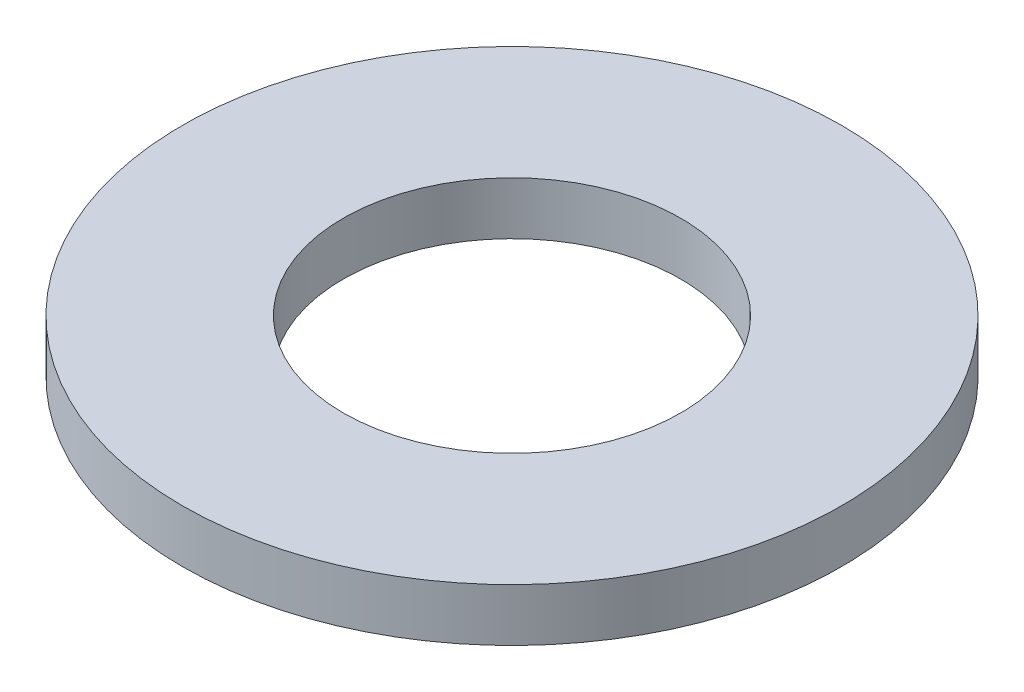
ISO-10303-21;
HEADER;
FILE_DESCRIPTION(('STEP AP214'),'2;1');
FILE_NAME('part.step','',(''),(''),'','','');
FILE_SCHEMA(('AUTOMOTIVE_DESIGN { 1 0 10303 214 1 1 1 1 }'));
ENDSEC;
DATA;
#1=APPLICATION_CONTEXT('core data for automotive mechanical design processes');
#2=APPLICATION_PROTOCOL_DEFINITION('international standard','automotive_design',2000,#1);
#3=PRODUCT_CONTEXT('',#1,'mechanical');
#4=PRODUCT('Part','Part','',(#3));
#5=PRODUCT_RELATED_PRODUCT_CATEGORY('part','',(#4));
#6=PRODUCT_DEFINITION_FORMATION('','',#4);
#7=PRODUCT_DEFINITION_CONTEXT('part definition',#1,'design');
#8=PRODUCT_DEFINITION('design','',#6,#7);
#9=PRODUCT_DEFINITION_SHAPE('','',#8);
#10=(LENGTH_UNIT() NAMED_UNIT(*) SI_UNIT(.MILLI.,.METRE.));
#11=(NAMED_UNIT(*) PLANE_ANGLE_UNIT() SI_UNIT($,.RADIAN.));
#12=(NAMED_UNIT(*) SI_UNIT($,.STERADIAN.) SOLID_ANGLE_UNIT());
#13=UNCERTAINTY_MEASURE_WITH_UNIT(LENGTH_MEASURE(1.E-05),#10,'distance_accuracy_value','');
#14=(GEOMETRIC_REPRESENTATION_CONTEXT(3) GLOBAL_UNCERTAINTY_ASSIGNED_CONTEXT((#13)) GLOBAL_UNIT_ASSIGNED_CONTEXT((#10,
#11,#12)) REPRESENTATION_CONTEXT('',''));
#15=CARTESIAN_POINT('',(0.,0.,0.));
#16=DIRECTION('',(0.,0.,1.));
#17=DIRECTION('',(1.,0.,0.));
#18=AXIS2_PLACEMENT_3D('',#15,#16,#17);
#19=CARTESIAN_POINT('',(0.,1.,0.));
#20=DIRECTION('',(0.,1.,0.));
#21=DIRECTION('',(0.,0.,1.));
#22=AXIS2_PLACEMENT_3D('',#19,#20,#21);
#23=PLANE('',#22);
#24=CARTESIAN_POINT('',(0.,1.,0.));
#25=DIRECTION('',(0.,1.,0.));
#26=DIRECTION('',(0.,0.,1.));
#27=AXIS2_PLACEMENT_3D('',#24,#25,#26);
#28=CIRCLE('',#27,6.25);
#29=CARTESIAN_POINT('',(0.,1.,6.25));
#30=VERTEX_POINT('',#29);
#31=EDGE_CURVE('E10',#30,#30,#28,.T.);
#32=ORIENTED_EDGE('',*,*,#31,.T.);
#33=EDGE_LOOP('',(#32));
#34=FACE_BOUND('',#33,.T.);
#35=CARTESIAN_POINT('',(0.,1.,0.));
#36=DIRECTION('',(0.,1.,0.));
#37=DIRECTION('',(0.,0.,1.));
#38=AXIS2_PLACEMENT_3D('',#35,#36,#37);
#39=CIRCLE('',#38,3.2);
#40=CARTESIAN_POINT('',(0.,1.,3.2));
#41=VERTEX_POINT('',#40);
#42=EDGE_CURVE('E48',#41,#41,#39,.T.);
#43=ORIENTED_EDGE('',*,*,#42,.F.);
#44=EDGE_LOOP('',(#43));
#45=FACE_BOUND('',#44,.T.);
#46=ADVANCED_FACE('F37',(#34,#45),#23,.T.);
#47=CARTESIAN_POINT('',(0.,0.,0.));
#48=DIRECTION('',(0.,1.,0.));
#49=DIRECTION('',(0.,0.,1.));
#50=AXIS2_PLACEMENT_3D('',#47,#48,#49);
#51=PLANE('',#50);
#52=CARTESIAN_POINT('',(0.,0.,0.));
#53=DIRECTION('',(0.,1.,0.));
#54=DIRECTION('',(0.,0.,1.));
#55=AXIS2_PLACEMENT_3D('',#52,#53,#54);
#56=CIRCLE('',#55,6.25);
#57=CARTESIAN_POINT('',(0.,0.,6.25));
#58=VERTEX_POINT('',#57);
#59=EDGE_CURVE('E41',#58,#58,#56,.T.);
#60=ORIENTED_EDGE('',*,*,#59,.F.);
#61=EDGE_LOOP('',(#60));
#62=FACE_BOUND('',#61,.T.);
#63=CARTESIAN_POINT('',(0.,0.,0.));
#64=DIRECTION('',(0.,1.,0.));
#65=DIRECTION('',(0.,0.,1.));
#66=AXIS2_PLACEMENT_3D('',#63,#64,#65);
#67=CIRCLE('',#66,3.2);
#68=CARTESIAN_POINT('',(0.,0.,3.2));
#69=VERTEX_POINT('',#68);
#70=EDGE_CURVE('E50',#69,#69,#67,.T.);
#71=ORIENTED_EDGE('',*,*,#70,.T.);
#72=EDGE_LOOP('',(#71));
#73=FACE_BOUND('',#72,.T.);
#74=ADVANCED_FACE('F60',(#62,#73),#51,.F.);
#75=CARTESIAN_POINT('',(0.,1.,0.));
#76=DIRECTION('',(0.,-1.,0.));
#77=DIRECTION('',(0.,0.,-1.));
#78=AXIS2_PLACEMENT_3D('',#75,#76,#77);
#79=CYLINDRICAL_SURFACE('',#78,6.25);
#80=ORIENTED_EDGE('',*,*,#31,.F.);
#81=EDGE_LOOP('',(#80));
#82=FACE_BOUND('',#81,.T.);
#83=ORIENTED_EDGE('',*,*,#59,.T.);
#84=EDGE_LOOP('',(#83));
#85=FACE_BOUND('',#84,.T.);
#86=ADVANCED_FACE('F39',(#82,#85),#79,.T.);
#87=CARTESIAN_POINT('',(0.,1.,0.));
#88=DIRECTION('',(0.,-1.,0.));
#89=DIRECTION('',(0.,0.,-1.));
#90=AXIS2_PLACEMENT_3D('',#87,#88,#89);
#91=CYLINDRICAL_SURFACE('',#90,3.2);
#92=ORIENTED_EDGE('',*,*,#42,.T.);
#93=EDGE_LOOP('',(#92));
#94=FACE_BOUND('',#93,.T.);
#95=ORIENTED_EDGE('',*,*,#70,.F.);
#96=EDGE_LOOP('',(#95));
#97=FACE_BOUND('',#96,.T.);
#98=ADVANCED_FACE('F56',(#94,#97),#91,.F.);
#99=CLOSED_SHELL('',(#46,#74,#86,#98));
#100=MANIFOLD_SOLID_BREP('B2',#99);
#101=ADVANCED_BREP_SHAPE_REPRESENTATION('',(#18,#100),#14);
#102=SHAPE_DEFINITION_REPRESENTATION(#9,#101);
ENDSEC;
END-ISO-10303-21;
